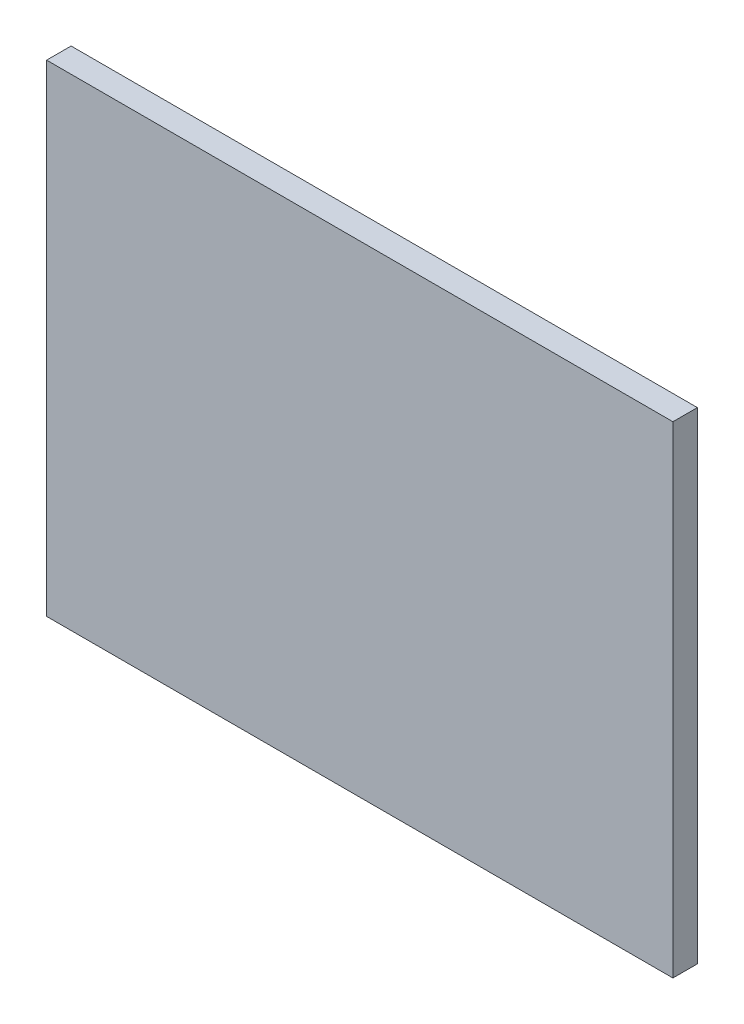
ISO-10303-21;
HEADER;
FILE_DESCRIPTION(('STEP AP214'),'2;1');
FILE_NAME('part.step','',(''),(''),'','','');
FILE_SCHEMA(('AUTOMOTIVE_DESIGN { 1 0 10303 214 1 1 1 1 }'));
ENDSEC;
DATA;
#1=APPLICATION_CONTEXT('core data for automotive mechanical design processes');
#2=APPLICATION_PROTOCOL_DEFINITION('international standard','automotive_design',2000,#1);
#3=PRODUCT_CONTEXT('',#1,'mechanical');
#4=PRODUCT('Part','Part','',(#3));
#5=PRODUCT_RELATED_PRODUCT_CATEGORY('part','',(#4));
#6=PRODUCT_DEFINITION_FORMATION('','',#4);
#7=PRODUCT_DEFINITION_CONTEXT('part definition',#1,'design');
#8=PRODUCT_DEFINITION('design','',#6,#7);
#9=PRODUCT_DEFINITION_SHAPE('','',#8);
#10=(LENGTH_UNIT() NAMED_UNIT(*) SI_UNIT(.MILLI.,.METRE.));
#11=(NAMED_UNIT(*) PLANE_ANGLE_UNIT() SI_UNIT($,.RADIAN.));
#12=(NAMED_UNIT(*) SI_UNIT($,.STERADIAN.) SOLID_ANGLE_UNIT());
#13=UNCERTAINTY_MEASURE_WITH_UNIT(LENGTH_MEASURE(1.E-05),#10,'distance_accuracy_value','');
#14=(GEOMETRIC_REPRESENTATION_CONTEXT(3) GLOBAL_UNCERTAINTY_ASSIGNED_CONTEXT((#13)) GLOBAL_UNIT_ASSIGNED_CONTEXT((#10,
#11,#12)) REPRESENTATION_CONTEXT('',''));
#15=CARTESIAN_POINT('',(0.,0.,0.));
#16=DIRECTION('',(0.,0.,1.));
#17=DIRECTION('',(1.,0.,0.));
#18=AXIS2_PLACEMENT_3D('',#15,#16,#17);
#19=CARTESIAN_POINT('',(-32.5,-25.,2.54));
#20=DIRECTION('',(1.,0.,0.));
#21=DIRECTION('',(0.,0.,-1.));
#22=AXIS2_PLACEMENT_3D('',#19,#20,#21);
#23=PLANE('',#22);
#24=DIRECTION('',(0.,-1.,0.));
#25=VECTOR('',#24,1.);
#26=CARTESIAN_POINT('',(-32.5,-25.,0.));
#27=LINE('',#26,#25);
#28=CARTESIAN_POINT('',(-32.5,25.,0.));
#29=VERTEX_POINT('',#28);
#30=CARTESIAN_POINT('',(-32.5,-25.,0.));
#31=VERTEX_POINT('',#30);
#32=EDGE_CURVE('E98',#29,#31,#27,.T.);
#33=ORIENTED_EDGE('',*,*,#32,.T.);
#34=DIRECTION('',(0.,0.,-1.));
#35=VECTOR('',#34,1.);
#36=CARTESIAN_POINT('',(-32.5,-25.,2.54));
#37=LINE('',#36,#35);
#38=CARTESIAN_POINT('',(-32.5,-25.,2.54));
#39=VERTEX_POINT('',#38);
#40=EDGE_CURVE('E11',#39,#31,#37,.T.);
#41=ORIENTED_EDGE('',*,*,#40,.F.);
#42=DIRECTION('',(0.,-1.,0.));
#43=VECTOR('',#42,1.);
#44=CARTESIAN_POINT('',(-32.5,-25.,2.54));
#45=LINE('',#44,#43);
#46=CARTESIAN_POINT('',(-32.5,25.,2.54));
#47=VERTEX_POINT('',#46);
#48=EDGE_CURVE('E86',#47,#39,#45,.T.);
#49=ORIENTED_EDGE('',*,*,#48,.F.);
#50=DIRECTION('',(0.,0.,-1.));
#51=VECTOR('',#50,1.);
#52=CARTESIAN_POINT('',(-32.5,25.,2.54));
#53=LINE('',#52,#51);
#54=EDGE_CURVE('E94',#47,#29,#53,.T.);
#55=ORIENTED_EDGE('',*,*,#54,.T.);
#56=EDGE_LOOP('',(#33,#41,#49,#55));
#57=FACE_BOUND('',#56,.T.);
#58=ADVANCED_FACE('F35',(#57),#23,.F.);
#59=CARTESIAN_POINT('',(32.5,-25.,2.54));
#60=DIRECTION('',(0.,1.,0.));
#61=DIRECTION('',(-1.,0.,0.));
#62=AXIS2_PLACEMENT_3D('',#59,#60,#61);
#63=PLANE('',#62);
#64=DIRECTION('',(1.,0.,0.));
#65=VECTOR('',#64,1.);
#66=CARTESIAN_POINT('',(32.5,-25.,0.));
#67=LINE('',#66,#65);
#68=CARTESIAN_POINT('',(32.5,-25.,0.));
#69=VERTEX_POINT('',#68);
#70=EDGE_CURVE('E90',#31,#69,#67,.T.);
#71=ORIENTED_EDGE('',*,*,#70,.T.);
#72=DIRECTION('',(0.,0.,-1.));
#73=VECTOR('',#72,1.);
#74=CARTESIAN_POINT('',(32.5,-25.,2.54));
#75=LINE('',#74,#73);
#76=CARTESIAN_POINT('',(32.5,-25.,2.54));
#77=VERTEX_POINT('',#76);
#78=EDGE_CURVE('E43',#77,#69,#75,.T.);
#79=ORIENTED_EDGE('',*,*,#78,.F.);
#80=DIRECTION('',(1.,0.,0.));
#81=VECTOR('',#80,1.);
#82=CARTESIAN_POINT('',(32.5,-25.,2.54));
#83=LINE('',#82,#81);
#84=EDGE_CURVE('E81',#39,#77,#83,.T.);
#85=ORIENTED_EDGE('',*,*,#84,.F.);
#86=ORIENTED_EDGE('',*,*,#40,.T.);
#87=EDGE_LOOP('',(#71,#79,#85,#86));
#88=FACE_BOUND('',#87,.T.);
#89=ADVANCED_FACE('F89',(#88),#63,.F.);
#90=CARTESIAN_POINT('',(32.5,-25.,2.54));
#91=DIRECTION('',(-1.,0.,0.));
#92=DIRECTION('',(0.,0.,1.));
#93=AXIS2_PLACEMENT_3D('',#90,#91,#92);
#94=PLANE('',#93);
#95=DIRECTION('',(0.,1.,0.));
#96=VECTOR('',#95,1.);
#97=CARTESIAN_POINT('',(32.5,-25.,0.));
#98=LINE('',#97,#96);
#99=CARTESIAN_POINT('',(32.5,25.,0.));
#100=VERTEX_POINT('',#99);
#101=EDGE_CURVE('E68',#69,#100,#98,.T.);
#102=ORIENTED_EDGE('',*,*,#101,.T.);
#103=DIRECTION('',(0.,0.,-1.));
#104=VECTOR('',#103,1.);
#105=CARTESIAN_POINT('',(32.5,25.,2.54));
#106=LINE('',#105,#104);
#107=CARTESIAN_POINT('',(32.5,25.,2.54));
#108=VERTEX_POINT('',#107);
#109=EDGE_CURVE('E91',#108,#100,#106,.T.);
#110=ORIENTED_EDGE('',*,*,#109,.F.);
#111=DIRECTION('',(0.,1.,0.));
#112=VECTOR('',#111,1.);
#113=CARTESIAN_POINT('',(32.5,-25.,2.54));
#114=LINE('',#113,#112);
#115=EDGE_CURVE('E84',#77,#108,#114,.T.);
#116=ORIENTED_EDGE('',*,*,#115,.F.);
#117=ORIENTED_EDGE('',*,*,#78,.T.);
#118=EDGE_LOOP('',(#102,#110,#116,#117));
#119=FACE_BOUND('',#118,.T.);
#120=ADVANCED_FACE('F92',(#119),#94,.F.);
#121=CARTESIAN_POINT('',(32.5,25.,2.54));
#122=DIRECTION('',(0.,-1.,0.));
#123=DIRECTION('',(1.,0.,0.));
#124=AXIS2_PLACEMENT_3D('',#121,#122,#123);
#125=PLANE('',#124);
#126=DIRECTION('',(-1.,0.,0.));
#127=VECTOR('',#126,1.);
#128=CARTESIAN_POINT('',(32.5,25.,0.));
#129=LINE('',#128,#127);
#130=EDGE_CURVE('E74',#100,#29,#129,.T.);
#131=ORIENTED_EDGE('',*,*,#130,.T.);
#132=ORIENTED_EDGE('',*,*,#54,.F.);
#133=DIRECTION('',(-1.,0.,0.));
#134=VECTOR('',#133,1.);
#135=CARTESIAN_POINT('',(32.5,25.,2.54));
#136=LINE('',#135,#134);
#137=EDGE_CURVE('E51',#108,#47,#136,.T.);
#138=ORIENTED_EDGE('',*,*,#137,.F.);
#139=ORIENTED_EDGE('',*,*,#109,.T.);
#140=EDGE_LOOP('',(#131,#132,#138,#139));
#141=FACE_BOUND('',#140,.T.);
#142=ADVANCED_FACE('F105',(#141),#125,.F.);
#143=CARTESIAN_POINT('',(0.,0.,2.54));
#144=DIRECTION('',(0.,0.,1.));
#145=DIRECTION('',(1.,0.,0.));
#146=AXIS2_PLACEMENT_3D('',#143,#144,#145);
#147=PLANE('',#146);
#148=ORIENTED_EDGE('',*,*,#48,.T.);
#149=ORIENTED_EDGE('',*,*,#84,.T.);
#150=ORIENTED_EDGE('',*,*,#115,.T.);
#151=ORIENTED_EDGE('',*,*,#137,.T.);
#152=EDGE_LOOP('',(#148,#149,#150,#151));
#153=FACE_BOUND('',#152,.T.);
#154=ADVANCED_FACE('F82',(#153),#147,.T.);
#155=CARTESIAN_POINT('',(0.,0.,0.));
#156=DIRECTION('',(0.,0.,1.));
#157=DIRECTION('',(1.,0.,0.));
#158=AXIS2_PLACEMENT_3D('',#155,#156,#157);
#159=PLANE('',#158);
#160=ORIENTED_EDGE('',*,*,#32,.F.);
#161=ORIENTED_EDGE('',*,*,#130,.F.);
#162=ORIENTED_EDGE('',*,*,#101,.F.);
#163=ORIENTED_EDGE('',*,*,#70,.F.);
#164=EDGE_LOOP('',(#160,#161,#162,#163));
#165=FACE_BOUND('',#164,.T.);
#166=ADVANCED_FACE('F108',(#165),#159,.F.);
#167=CLOSED_SHELL('',(#58,#89,#120,#142,#154,#166));
#168=MANIFOLD_SOLID_BREP('B2',#167);
#169=ADVANCED_BREP_SHAPE_REPRESENTATION('',(#18,#168),#14);
#170=SHAPE_DEFINITION_REPRESENTATION(#9,#169);
ENDSEC;
END-ISO-10303-21;
